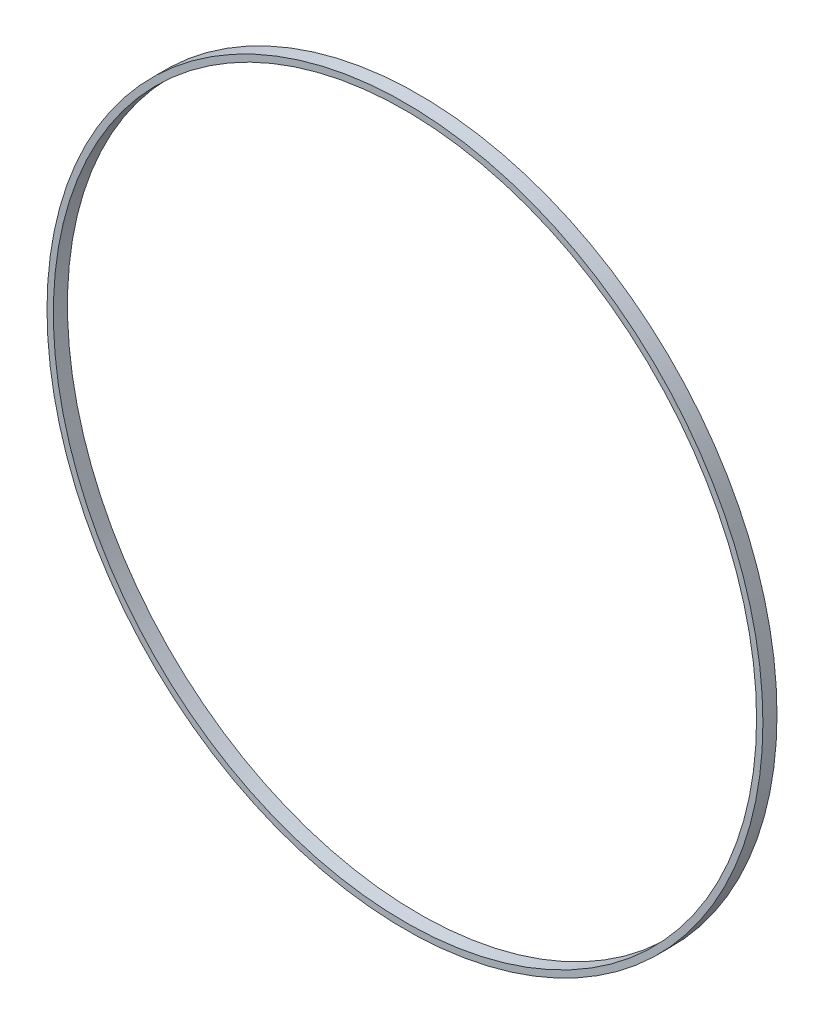
ISO-10303-21;
HEADER;
FILE_DESCRIPTION(('STEP AP214'),'2;1');
FILE_NAME('part.step','',(''),(''),'','','');
FILE_SCHEMA(('AUTOMOTIVE_DESIGN { 1 0 10303 214 1 1 1 1 }'));
ENDSEC;
DATA;
#1=APPLICATION_CONTEXT('core data for automotive mechanical design processes');
#2=APPLICATION_PROTOCOL_DEFINITION('international standard','automotive_design',2000,#1);
#3=PRODUCT_CONTEXT('',#1,'mechanical');
#4=PRODUCT('Part','Part','',(#3));
#5=PRODUCT_RELATED_PRODUCT_CATEGORY('part','',(#4));
#6=PRODUCT_DEFINITION_FORMATION('','',#4);
#7=PRODUCT_DEFINITION_CONTEXT('part definition',#1,'design');
#8=PRODUCT_DEFINITION('design','',#6,#7);
#9=PRODUCT_DEFINITION_SHAPE('','',#8);
#10=(LENGTH_UNIT() NAMED_UNIT(*) SI_UNIT(.MILLI.,.METRE.));
#11=(NAMED_UNIT(*) PLANE_ANGLE_UNIT() SI_UNIT($,.RADIAN.));
#12=(NAMED_UNIT(*) SI_UNIT($,.STERADIAN.) SOLID_ANGLE_UNIT());
#13=UNCERTAINTY_MEASURE_WITH_UNIT(LENGTH_MEASURE(1.E-05),#10,'distance_accuracy_value','');
#14=(GEOMETRIC_REPRESENTATION_CONTEXT(3) GLOBAL_UNCERTAINTY_ASSIGNED_CONTEXT((#13)) GLOBAL_UNIT_ASSIGNED_CONTEXT((#10,
#11,#12)) REPRESENTATION_CONTEXT('',''));
#15=CARTESIAN_POINT('',(0.,0.,0.));
#16=DIRECTION('',(0.,0.,1.));
#17=DIRECTION('',(1.,0.,0.));
#18=AXIS2_PLACEMENT_3D('',#15,#16,#17);
#19=CARTESIAN_POINT('',(0.,0.,0.8));
#20=DIRECTION('',(0.,0.,1.));
#21=DIRECTION('',(1.,0.,0.));
#22=AXIS2_PLACEMENT_3D('',#19,#20,#21);
#23=PLANE('',#22);
#24=CARTESIAN_POINT('',(0.,0.,0.8));
#25=DIRECTION('',(0.,0.,1.));
#26=DIRECTION('',(1.,0.,0.));
#27=AXIS2_PLACEMENT_3D('',#24,#25,#26);
#28=CIRCLE('',#27,20.31);
#29=CARTESIAN_POINT('',(20.31,0.,0.8));
#30=VERTEX_POINT('',#29);
#31=EDGE_CURVE('E10',#30,#30,#28,.T.);
#32=ORIENTED_EDGE('',*,*,#31,.T.);
#33=EDGE_LOOP('',(#32));
#34=FACE_BOUND('',#33,.T.);
#35=CARTESIAN_POINT('',(0.,0.,0.8));
#36=DIRECTION('',(0.,0.,1.));
#37=DIRECTION('',(1.,0.,0.));
#38=AXIS2_PLACEMENT_3D('',#35,#36,#37);
#39=CIRCLE('',#38,19.95);
#40=CARTESIAN_POINT('',(19.95,0.,0.8));
#41=VERTEX_POINT('',#40);
#42=EDGE_CURVE('E50',#41,#41,#39,.T.);
#43=ORIENTED_EDGE('',*,*,#42,.F.);
#44=EDGE_LOOP('',(#43));
#45=FACE_BOUND('',#44,.T.);
#46=ADVANCED_FACE('F39',(#34,#45),#23,.T.);
#47=CARTESIAN_POINT('',(0.,0.,0.));
#48=DIRECTION('',(0.,0.,1.));
#49=DIRECTION('',(1.,0.,0.));
#50=AXIS2_PLACEMENT_3D('',#47,#48,#49);
#51=PLANE('',#50);
#52=CARTESIAN_POINT('',(0.,0.,0.));
#53=DIRECTION('',(0.,0.,1.));
#54=DIRECTION('',(1.,0.,0.));
#55=AXIS2_PLACEMENT_3D('',#52,#53,#54);
#56=CIRCLE('',#55,20.31);
#57=CARTESIAN_POINT('',(20.31,0.,0.));
#58=VERTEX_POINT('',#57);
#59=EDGE_CURVE('E43',#58,#58,#56,.T.);
#60=ORIENTED_EDGE('',*,*,#59,.F.);
#61=EDGE_LOOP('',(#60));
#62=FACE_BOUND('',#61,.T.);
#63=CARTESIAN_POINT('',(0.,0.,0.));
#64=DIRECTION('',(0.,0.,1.));
#65=DIRECTION('',(1.,0.,0.));
#66=AXIS2_PLACEMENT_3D('',#63,#64,#65);
#67=CIRCLE('',#66,19.95);
#68=CARTESIAN_POINT('',(19.95,0.,0.));
#69=VERTEX_POINT('',#68);
#70=EDGE_CURVE('E52',#69,#69,#67,.T.);
#71=ORIENTED_EDGE('',*,*,#70,.T.);
#72=EDGE_LOOP('',(#71));
#73=FACE_BOUND('',#72,.T.);
#74=ADVANCED_FACE('F62',(#62,#73),#51,.F.);
#75=CARTESIAN_POINT('',(0.,0.,0.8));
#76=DIRECTION('',(0.,0.,-1.));
#77=DIRECTION('',(-1.,0.,0.));
#78=AXIS2_PLACEMENT_3D('',#75,#76,#77);
#79=CYLINDRICAL_SURFACE('',#78,20.31);
#80=ORIENTED_EDGE('',*,*,#31,.F.);
#81=EDGE_LOOP('',(#80));
#82=FACE_BOUND('',#81,.T.);
#83=ORIENTED_EDGE('',*,*,#59,.T.);
#84=EDGE_LOOP('',(#83));
#85=FACE_BOUND('',#84,.T.);
#86=ADVANCED_FACE('F41',(#82,#85),#79,.T.);
#87=CARTESIAN_POINT('',(0.,0.,0.8));
#88=DIRECTION('',(0.,0.,-1.));
#89=DIRECTION('',(-1.,0.,0.));
#90=AXIS2_PLACEMENT_3D('',#87,#88,#89);
#91=CYLINDRICAL_SURFACE('',#90,19.95);
#92=ORIENTED_EDGE('',*,*,#42,.T.);
#93=EDGE_LOOP('',(#92));
#94=FACE_BOUND('',#93,.T.);
#95=ORIENTED_EDGE('',*,*,#70,.F.);
#96=EDGE_LOOP('',(#95));
#97=FACE_BOUND('',#96,.T.);
#98=ADVANCED_FACE('F58',(#94,#97),#91,.F.);
#99=CLOSED_SHELL('',(#46,#74,#86,#98));
#100=MANIFOLD_SOLID_BREP('B2',#99);
#101=ADVANCED_BREP_SHAPE_REPRESENTATION('',(#18,#100),#14);
#102=SHAPE_DEFINITION_REPRESENTATION(#9,#101);
ENDSEC;
END-ISO-10303-21;
